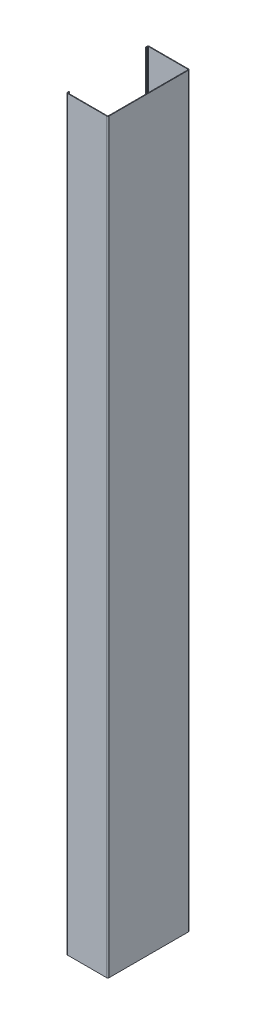
ISO-10303-21;
HEADER;
FILE_DESCRIPTION(('STEP AP214'),'2;1');
FILE_NAME('part.step','',(''),(''),'','','');
FILE_SCHEMA(('AUTOMOTIVE_DESIGN { 1 0 10303 214 1 1 1 1 }'));
ENDSEC;
DATA;
#1=APPLICATION_CONTEXT('core data for automotive mechanical design processes');
#2=APPLICATION_PROTOCOL_DEFINITION('international standard','automotive_design',2000,#1);
#3=PRODUCT_CONTEXT('',#1,'mechanical');
#4=PRODUCT('Part','Part','',(#3));
#5=PRODUCT_RELATED_PRODUCT_CATEGORY('part','',(#4));
#6=PRODUCT_DEFINITION_FORMATION('','',#4);
#7=PRODUCT_DEFINITION_CONTEXT('part definition',#1,'design');
#8=PRODUCT_DEFINITION('design','',#6,#7);
#9=PRODUCT_DEFINITION_SHAPE('','',#8);
#10=(LENGTH_UNIT() NAMED_UNIT(*) SI_UNIT(.MILLI.,.METRE.));
#11=(NAMED_UNIT(*) PLANE_ANGLE_UNIT() SI_UNIT($,.RADIAN.));
#12=(NAMED_UNIT(*) SI_UNIT($,.STERADIAN.) SOLID_ANGLE_UNIT());
#13=UNCERTAINTY_MEASURE_WITH_UNIT(LENGTH_MEASURE(1.E-05),#10,'distance_accuracy_value','');
#14=(GEOMETRIC_REPRESENTATION_CONTEXT(3) GLOBAL_UNCERTAINTY_ASSIGNED_CONTEXT((#13)) GLOBAL_UNIT_ASSIGNED_CONTEXT((#10,
#11,#12)) REPRESENTATION_CONTEXT('',''));
#15=CARTESIAN_POINT('',(0.,0.,0.));
#16=DIRECTION('',(0.,0.,1.));
#17=DIRECTION('',(1.,0.,0.));
#18=AXIS2_PLACEMENT_3D('',#15,#16,#17);
#19=CARTESIAN_POINT('',(-50.,3000.,-49.25));
#20=DIRECTION('',(1.,0.,0.));
#21=DIRECTION('',(0.,0.,-1.));
#22=AXIS2_PLACEMENT_3D('',#19,#20,#21);
#23=PLANE('',#22);
#24=DIRECTION('',(0.,0.,-1.));
#25=VECTOR('',#24,1.);
#26=CARTESIAN_POINT('',(-50.,899.25,49.25));
#27=LINE('',#26,#25);
#28=CARTESIAN_POINT('',(-50.,899.25,-46.25));
#29=VERTEX_POINT('',#28);
#30=CARTESIAN_POINT('',(-50.,899.25,-47.75));
#31=VERTEX_POINT('',#30);
#32=EDGE_CURVE('E184',#29,#31,#27,.T.);
#33=ORIENTED_EDGE('',*,*,#32,.T.);
#34=DIRECTION('',(0.,-1.,0.));
#35=VECTOR('',#34,1.);
#36=CARTESIAN_POINT('',(-50.,3000.,-47.75));
#37=LINE('',#36,#35);
#38=CARTESIAN_POINT('',(-50.,0.,-47.75));
#39=VERTEX_POINT('',#38);
#40=EDGE_CURVE('E59',#31,#39,#37,.T.);
#41=ORIENTED_EDGE('',*,*,#40,.T.);
#42=DIRECTION('',(0.,0.,1.));
#43=VECTOR('',#42,1.);
#44=CARTESIAN_POINT('',(-50.,0.,-49.25));
#45=LINE('',#44,#43);
#46=CARTESIAN_POINT('',(-50.,0.,-46.25));
#47=VERTEX_POINT('',#46);
#48=EDGE_CURVE('E236',#39,#47,#45,.T.);
#49=ORIENTED_EDGE('',*,*,#48,.T.);
#50=DIRECTION('',(0.,-1.,0.));
#51=VECTOR('',#50,1.);
#52=CARTESIAN_POINT('',(-50.,3000.,-46.25));
#53=LINE('',#52,#51);
#54=EDGE_CURVE('E45',#29,#47,#53,.T.);
#55=ORIENTED_EDGE('',*,*,#54,.F.);
#56=EDGE_LOOP('',(#33,#41,#49,#55));
#57=FACE_BOUND('',#56,.T.);
#58=ADVANCED_FACE('F38',(#57),#23,.F.);
#59=CARTESIAN_POINT('',(-49.25,3000.,-46.25));
#60=DIRECTION('',(0.,0.,1.));
#61=DIRECTION('',(1.,0.,0.));
#62=AXIS2_PLACEMENT_3D('',#59,#60,#61);
#63=PLANE('',#62);
#64=DIRECTION('',(0.,-1.,0.));
#65=VECTOR('',#64,1.);
#66=CARTESIAN_POINT('',(-49.25,3000.,-46.25));
#67=LINE('',#66,#65);
#68=CARTESIAN_POINT('',(-49.25,899.25,-46.25));
#69=VERTEX_POINT('',#68);
#70=CARTESIAN_POINT('',(-49.25,0.,-46.25));
#71=VERTEX_POINT('',#70);
#72=EDGE_CURVE('E224',#69,#71,#67,.T.);
#73=ORIENTED_EDGE('',*,*,#72,.F.);
#74=DIRECTION('',(-1.,0.,0.));
#75=VECTOR('',#74,1.);
#76=CARTESIAN_POINT('',(-49.25,899.25,-46.25));
#77=LINE('',#76,#75);
#78=EDGE_CURVE('E234',#69,#29,#77,.T.);
#79=ORIENTED_EDGE('',*,*,#78,.T.);
#80=ORIENTED_EDGE('',*,*,#54,.T.);
#81=DIRECTION('',(-1.,0.,0.));
#82=VECTOR('',#81,1.);
#83=CARTESIAN_POINT('',(-49.25,0.,-46.25));
#84=LINE('',#83,#82);
#85=EDGE_CURVE('E232',#71,#47,#84,.T.);
#86=ORIENTED_EDGE('',*,*,#85,.F.);
#87=EDGE_LOOP('',(#73,#79,#80,#86));
#88=FACE_BOUND('',#87,.T.);
#89=ADVANCED_FACE('F230',(#88),#63,.T.);
#90=CARTESIAN_POINT('',(-49.25,3000.,-49.25));
#91=DIRECTION('',(1.,0.,0.));
#92=DIRECTION('',(0.,0.,-1.));
#93=AXIS2_PLACEMENT_3D('',#90,#91,#92);
#94=PLANE('',#93);
#95=DIRECTION('',(0.,-1.,0.));
#96=VECTOR('',#95,1.);
#97=CARTESIAN_POINT('',(-49.25,3000.,-47.75));
#98=LINE('',#97,#96);
#99=CARTESIAN_POINT('',(-49.25,899.25,-47.75));
#100=VERTEX_POINT('',#99);
#101=CARTESIAN_POINT('',(-49.25,0.,-47.75));
#102=VERTEX_POINT('',#101);
#103=EDGE_CURVE('E222',#100,#102,#98,.T.);
#104=ORIENTED_EDGE('',*,*,#103,.F.);
#105=DIRECTION('',(0.,0.,1.));
#106=VECTOR('',#105,1.);
#107=CARTESIAN_POINT('',(-49.25,899.25,-49.25));
#108=LINE('',#107,#106);
#109=EDGE_CURVE('E352',#100,#69,#108,.T.);
#110=ORIENTED_EDGE('',*,*,#109,.T.);
#111=ORIENTED_EDGE('',*,*,#72,.T.);
#112=DIRECTION('',(0.,0.,-1.));
#113=VECTOR('',#112,1.);
#114=CARTESIAN_POINT('',(-49.25,0.,-49.25));
#115=LINE('',#114,#113);
#116=EDGE_CURVE('E244',#102,#71,#115,.F.);
#117=ORIENTED_EDGE('',*,*,#116,.F.);
#118=EDGE_LOOP('',(#104,#110,#111,#117));
#119=FACE_BOUND('',#118,.T.);
#120=ADVANCED_FACE('F356',(#119),#94,.T.);
#121=CARTESIAN_POINT('',(-48.5,3000.,-47.75));
#122=DIRECTION('',(0.,-1.,0.));
#123=DIRECTION('',(0.,0.,-1.));
#124=AXIS2_PLACEMENT_3D('',#121,#122,#123);
#125=CYLINDRICAL_SURFACE('',#124,0.75);
#126=DIRECTION('',(0.,-1.,0.));
#127=VECTOR('',#126,1.);
#128=CARTESIAN_POINT('',(-48.5,3000.,-48.5));
#129=LINE('',#128,#127);
#130=CARTESIAN_POINT('',(-48.5,899.25,-48.5));
#131=VERTEX_POINT('',#130);
#132=CARTESIAN_POINT('',(-48.5,0.,-48.5));
#133=VERTEX_POINT('',#132);
#134=EDGE_CURVE('E220',#131,#133,#129,.T.);
#135=ORIENTED_EDGE('',*,*,#134,.F.);
#136=CARTESIAN_POINT('',(-48.5,899.25,-47.75));
#137=DIRECTION('',(0.,1.,0.));
#138=DIRECTION('',(0.,0.,1.));
#139=AXIS2_PLACEMENT_3D('',#136,#137,#138);
#140=CIRCLE('',#139,0.75);
#141=EDGE_CURVE('E349',#131,#100,#140,.T.);
#142=ORIENTED_EDGE('',*,*,#141,.T.);
#143=ORIENTED_EDGE('',*,*,#103,.T.);
#144=CARTESIAN_POINT('',(-48.5,0.,-47.75));
#145=DIRECTION('',(0.,1.,0.));
#146=DIRECTION('',(1.,0.,0.));
#147=AXIS2_PLACEMENT_3D('',#144,#145,#146);
#148=CIRCLE('',#147,0.75);
#149=EDGE_CURVE('E246',#133,#102,#148,.T.);
#150=ORIENTED_EDGE('',*,*,#149,.F.);
#151=EDGE_LOOP('',(#135,#142,#143,#150));
#152=FACE_BOUND('',#151,.T.);
#153=ADVANCED_FACE('F359',(#152),#125,.F.);
#154=CARTESIAN_POINT('',(-50.,3000.,-48.5));
#155=DIRECTION('',(0.,0.,1.));
#156=DIRECTION('',(1.,0.,0.));
#157=AXIS2_PLACEMENT_3D('',#154,#155,#156);
#158=PLANE('',#157);
#159=DIRECTION('',(0.,-1.,0.));
#160=VECTOR('',#159,1.);
#161=CARTESIAN_POINT('',(-1.50000000000004,3000.,-48.5));
#162=LINE('',#161,#160);
#163=CARTESIAN_POINT('',(-1.50000000000004,899.25,-48.5));
#164=VERTEX_POINT('',#163);
#165=CARTESIAN_POINT('',(-1.50000000000004,0.,-48.5));
#166=VERTEX_POINT('',#165);
#167=EDGE_CURVE('E218',#164,#166,#162,.T.);
#168=ORIENTED_EDGE('',*,*,#167,.F.);
#169=DIRECTION('',(-1.,0.,0.));
#170=VECTOR('',#169,1.);
#171=CARTESIAN_POINT('',(-50.,899.25,-48.5));
#172=LINE('',#171,#170);
#173=EDGE_CURVE('E346',#164,#131,#172,.T.);
#174=ORIENTED_EDGE('',*,*,#173,.T.);
#175=ORIENTED_EDGE('',*,*,#134,.T.);
#176=DIRECTION('',(1.,0.,0.));
#177=VECTOR('',#176,1.);
#178=CARTESIAN_POINT('',(-50.,0.,-48.5));
#179=LINE('',#178,#177);
#180=EDGE_CURVE('E251',#166,#133,#179,.F.);
#181=ORIENTED_EDGE('',*,*,#180,.F.);
#182=EDGE_LOOP('',(#168,#174,#175,#181));
#183=FACE_BOUND('',#182,.T.);
#184=ADVANCED_FACE('F364',(#183),#158,.T.);
#185=CARTESIAN_POINT('',(-1.50000000000004,3000.,-47.75));
#186=DIRECTION('',(0.,-1.,0.));
#187=DIRECTION('',(0.,0.,-1.));
#188=AXIS2_PLACEMENT_3D('',#185,#186,#187);
#189=CYLINDRICAL_SURFACE('',#188,0.75);
#190=DIRECTION('',(0.,-1.,0.));
#191=VECTOR('',#190,1.);
#192=CARTESIAN_POINT('',(-0.750000000000037,3000.,-47.75));
#193=LINE('',#192,#191);
#194=CARTESIAN_POINT('',(-0.750000000000037,899.25,-47.75));
#195=VERTEX_POINT('',#194);
#196=CARTESIAN_POINT('',(-0.750000000000037,0.,-47.75));
#197=VERTEX_POINT('',#196);
#198=EDGE_CURVE('E216',#195,#197,#193,.T.);
#199=ORIENTED_EDGE('',*,*,#198,.F.);
#200=CARTESIAN_POINT('',(-1.50000000000004,899.25,-47.75));
#201=DIRECTION('',(0.,1.,0.));
#202=DIRECTION('',(0.,0.,1.));
#203=AXIS2_PLACEMENT_3D('',#200,#201,#202);
#204=CIRCLE('',#203,0.75);
#205=EDGE_CURVE('E343',#195,#164,#204,.T.);
#206=ORIENTED_EDGE('',*,*,#205,.T.);
#207=ORIENTED_EDGE('',*,*,#167,.T.);
#208=CARTESIAN_POINT('',(-1.50000000000004,0.,-47.75));
#209=DIRECTION('',(0.,1.,0.));
#210=DIRECTION('',(1.,0.,0.));
#211=AXIS2_PLACEMENT_3D('',#208,#209,#210);
#212=CIRCLE('',#211,0.75);
#213=EDGE_CURVE('E254',#197,#166,#212,.T.);
#214=ORIENTED_EDGE('',*,*,#213,.F.);
#215=EDGE_LOOP('',(#199,#206,#207,#214));
#216=FACE_BOUND('',#215,.T.);
#217=ADVANCED_FACE('F367',(#216),#189,.F.);
#218=CARTESIAN_POINT('',(-0.750000000000038,3000.,-49.25));
#219=DIRECTION('',(-1.,0.,0.));
#220=DIRECTION('',(0.,0.,1.));
#221=AXIS2_PLACEMENT_3D('',#218,#219,#220);
#222=PLANE('',#221);
#223=DIRECTION('',(0.,-1.,0.));
#224=VECTOR('',#223,1.);
#225=CARTESIAN_POINT('',(-0.749999999999984,3000.,47.75));
#226=LINE('',#225,#224);
#227=CARTESIAN_POINT('',(-0.749999999999984,899.25,47.75));
#228=VERTEX_POINT('',#227);
#229=CARTESIAN_POINT('',(-0.749999999999984,0.,47.75));
#230=VERTEX_POINT('',#229);
#231=EDGE_CURVE('E214',#228,#230,#226,.T.);
#232=ORIENTED_EDGE('',*,*,#231,.F.);
#233=DIRECTION('',(0.,0.,-1.));
#234=VECTOR('',#233,1.);
#235=CARTESIAN_POINT('',(-0.750000000000038,899.25,-49.25));
#236=LINE('',#235,#234);
#237=EDGE_CURVE('E340',#228,#195,#236,.T.);
#238=ORIENTED_EDGE('',*,*,#237,.T.);
#239=ORIENTED_EDGE('',*,*,#198,.T.);
#240=DIRECTION('',(0.,0.,-1.));
#241=VECTOR('',#240,1.);
#242=CARTESIAN_POINT('',(-0.750000000000038,0.,-49.25));
#243=LINE('',#242,#241);
#244=EDGE_CURVE('E257',#230,#197,#243,.T.);
#245=ORIENTED_EDGE('',*,*,#244,.F.);
#246=EDGE_LOOP('',(#232,#238,#239,#245));
#247=FACE_BOUND('',#246,.T.);
#248=ADVANCED_FACE('F372',(#247),#222,.T.);
#249=CARTESIAN_POINT('',(-1.49999999999998,3000.,47.75));
#250=DIRECTION('',(0.,-1.,0.));
#251=DIRECTION('',(0.,0.,-1.));
#252=AXIS2_PLACEMENT_3D('',#249,#250,#251);
#253=CYLINDRICAL_SURFACE('',#252,0.75);
#254=DIRECTION('',(0.,-1.,0.));
#255=VECTOR('',#254,1.);
#256=CARTESIAN_POINT('',(-1.49999999999998,3000.,48.5));
#257=LINE('',#256,#255);
#258=CARTESIAN_POINT('',(-1.49999999999998,899.25,48.5));
#259=VERTEX_POINT('',#258);
#260=CARTESIAN_POINT('',(-1.49999999999998,0.,48.5));
#261=VERTEX_POINT('',#260);
#262=EDGE_CURVE('E212',#259,#261,#257,.T.);
#263=ORIENTED_EDGE('',*,*,#262,.F.);
#264=CARTESIAN_POINT('',(-1.49999999999998,899.25,47.75));
#265=DIRECTION('',(0.,1.,0.));
#266=DIRECTION('',(0.,0.,1.));
#267=AXIS2_PLACEMENT_3D('',#264,#265,#266);
#268=CIRCLE('',#267,0.75);
#269=EDGE_CURVE('E337',#259,#228,#268,.T.);
#270=ORIENTED_EDGE('',*,*,#269,.T.);
#271=ORIENTED_EDGE('',*,*,#231,.T.);
#272=CARTESIAN_POINT('',(-1.49999999999998,0.,47.75));
#273=DIRECTION('',(0.,1.,0.));
#274=DIRECTION('',(1.,0.,0.));
#275=AXIS2_PLACEMENT_3D('',#272,#273,#274);
#276=CIRCLE('',#275,0.75);
#277=EDGE_CURVE('E260',#261,#230,#276,.T.);
#278=ORIENTED_EDGE('',*,*,#277,.F.);
#279=EDGE_LOOP('',(#263,#270,#271,#278));
#280=FACE_BOUND('',#279,.T.);
#281=ADVANCED_FACE('F375',(#280),#253,.F.);
#282=CARTESIAN_POINT('',(0.,3000.,48.5));
#283=DIRECTION('',(0.,0.,-1.));
#284=DIRECTION('',(-1.,0.,0.));
#285=AXIS2_PLACEMENT_3D('',#282,#283,#284);
#286=PLANE('',#285);
#287=DIRECTION('',(0.,-1.,0.));
#288=VECTOR('',#287,1.);
#289=CARTESIAN_POINT('',(-48.5,3000.,48.5));
#290=LINE('',#289,#288);
#291=CARTESIAN_POINT('',(-48.5,899.25,48.5));
#292=VERTEX_POINT('',#291);
#293=CARTESIAN_POINT('',(-48.5,0.,48.5));
#294=VERTEX_POINT('',#293);
#295=EDGE_CURVE('E210',#292,#294,#290,.T.);
#296=ORIENTED_EDGE('',*,*,#295,.F.);
#297=DIRECTION('',(1.,0.,0.));
#298=VECTOR('',#297,1.);
#299=CARTESIAN_POINT('',(0.,899.25,48.5));
#300=LINE('',#299,#298);
#301=EDGE_CURVE('E334',#292,#259,#300,.T.);
#302=ORIENTED_EDGE('',*,*,#301,.T.);
#303=ORIENTED_EDGE('',*,*,#262,.T.);
#304=DIRECTION('',(1.,0.,0.));
#305=VECTOR('',#304,1.);
#306=CARTESIAN_POINT('',(0.,0.,48.5));
#307=LINE('',#306,#305);
#308=EDGE_CURVE('E263',#294,#261,#307,.T.);
#309=ORIENTED_EDGE('',*,*,#308,.F.);
#310=EDGE_LOOP('',(#296,#302,#303,#309));
#311=FACE_BOUND('',#310,.T.);
#312=ADVANCED_FACE('F380',(#311),#286,.T.);
#313=CARTESIAN_POINT('',(-48.5,3000.,47.75));
#314=DIRECTION('',(0.,-1.,0.));
#315=DIRECTION('',(0.,0.,-1.));
#316=AXIS2_PLACEMENT_3D('',#313,#314,#315);
#317=CYLINDRICAL_SURFACE('',#316,0.75);
#318=DIRECTION('',(0.,-1.,0.));
#319=VECTOR('',#318,1.);
#320=CARTESIAN_POINT('',(-49.25,3000.,47.75));
#321=LINE('',#320,#319);
#322=CARTESIAN_POINT('',(-49.25,899.25,47.75));
#323=VERTEX_POINT('',#322);
#324=CARTESIAN_POINT('',(-49.25,0.,47.75));
#325=VERTEX_POINT('',#324);
#326=EDGE_CURVE('E208',#323,#325,#321,.T.);
#327=ORIENTED_EDGE('',*,*,#326,.F.);
#328=CARTESIAN_POINT('',(-48.5,899.25,47.75));
#329=DIRECTION('',(0.,1.,0.));
#330=DIRECTION('',(0.,0.,1.));
#331=AXIS2_PLACEMENT_3D('',#328,#329,#330);
#332=CIRCLE('',#331,0.75);
#333=EDGE_CURVE('E331',#323,#292,#332,.T.);
#334=ORIENTED_EDGE('',*,*,#333,.T.);
#335=ORIENTED_EDGE('',*,*,#295,.T.);
#336=CARTESIAN_POINT('',(-48.5,0.,47.75));
#337=DIRECTION('',(0.,1.,0.));
#338=DIRECTION('',(1.,0.,0.));
#339=AXIS2_PLACEMENT_3D('',#336,#337,#338);
#340=CIRCLE('',#339,0.75);
#341=EDGE_CURVE('E266',#325,#294,#340,.T.);
#342=ORIENTED_EDGE('',*,*,#341,.F.);
#343=EDGE_LOOP('',(#327,#334,#335,#342));
#344=FACE_BOUND('',#343,.T.);
#345=ADVANCED_FACE('F383',(#344),#317,.F.);
#346=CARTESIAN_POINT('',(-49.25,3000.,49.25));
#347=DIRECTION('',(1.,0.,0.));
#348=DIRECTION('',(0.,0.,-1.));
#349=AXIS2_PLACEMENT_3D('',#346,#347,#348);
#350=PLANE('',#349);
#351=DIRECTION('',(0.,-1.,0.));
#352=VECTOR('',#351,1.);
#353=CARTESIAN_POINT('',(-49.25,3000.,46.25));
#354=LINE('',#353,#352);
#355=CARTESIAN_POINT('',(-49.25,899.25,46.25));
#356=VERTEX_POINT('',#355);
#357=CARTESIAN_POINT('',(-49.25,0.,46.25));
#358=VERTEX_POINT('',#357);
#359=EDGE_CURVE('E201',#356,#358,#354,.T.);
#360=ORIENTED_EDGE('',*,*,#359,.F.);
#361=DIRECTION('',(0.,0.,1.));
#362=VECTOR('',#361,1.);
#363=CARTESIAN_POINT('',(-49.25,899.25,49.25));
#364=LINE('',#363,#362);
#365=EDGE_CURVE('E328',#356,#323,#364,.T.);
#366=ORIENTED_EDGE('',*,*,#365,.T.);
#367=ORIENTED_EDGE('',*,*,#326,.T.);
#368=DIRECTION('',(0.,0.,-1.));
#369=VECTOR('',#368,1.);
#370=CARTESIAN_POINT('',(-49.25,0.,49.25));
#371=LINE('',#370,#369);
#372=EDGE_CURVE('E269',#358,#325,#371,.F.);
#373=ORIENTED_EDGE('',*,*,#372,.F.);
#374=EDGE_LOOP('',(#360,#366,#367,#373));
#375=FACE_BOUND('',#374,.T.);
#376=ADVANCED_FACE('F388',(#375),#350,.T.);
#377=CARTESIAN_POINT('',(-50.,3000.,46.25));
#378=DIRECTION('',(0.,0.,-1.));
#379=DIRECTION('',(-1.,0.,0.));
#380=AXIS2_PLACEMENT_3D('',#377,#378,#379);
#381=PLANE('',#380);
#382=DIRECTION('',(0.,-1.,0.));
#383=VECTOR('',#382,1.);
#384=CARTESIAN_POINT('',(-50.,3000.,46.25));
#385=LINE('',#384,#383);
#386=CARTESIAN_POINT('',(-50.,899.25,46.25));
#387=VERTEX_POINT('',#386);
#388=CARTESIAN_POINT('',(-50.,0.,46.25));
#389=VERTEX_POINT('',#388);
#390=EDGE_CURVE('E199',#387,#389,#385,.T.);
#391=ORIENTED_EDGE('',*,*,#390,.F.);
#392=DIRECTION('',(1.,0.,0.));
#393=VECTOR('',#392,1.);
#394=CARTESIAN_POINT('',(-50.,899.25,46.25));
#395=LINE('',#394,#393);
#396=EDGE_CURVE('E179',#387,#356,#395,.T.);
#397=ORIENTED_EDGE('',*,*,#396,.T.);
#398=ORIENTED_EDGE('',*,*,#359,.T.);
#399=DIRECTION('',(1.,0.,0.));
#400=VECTOR('',#399,1.);
#401=CARTESIAN_POINT('',(-50.,0.,46.25));
#402=LINE('',#401,#400);
#403=EDGE_CURVE('E271',#389,#358,#402,.T.);
#404=ORIENTED_EDGE('',*,*,#403,.F.);
#405=EDGE_LOOP('',(#391,#397,#398,#404));
#406=FACE_BOUND('',#405,.T.);
#407=ADVANCED_FACE('F390',(#406),#381,.T.);
#408=CARTESIAN_POINT('',(-50.,3000.,49.25));
#409=DIRECTION('',(1.,0.,0.));
#410=DIRECTION('',(0.,0.,-1.));
#411=AXIS2_PLACEMENT_3D('',#408,#409,#410);
#412=PLANE('',#411);
#413=CARTESIAN_POINT('',(-50.,899.25,47.75));
#414=VERTEX_POINT('',#413);
#415=EDGE_CURVE('E173',#414,#387,#27,.T.);
#416=ORIENTED_EDGE('',*,*,#415,.T.);
#417=ORIENTED_EDGE('',*,*,#390,.T.);
#418=DIRECTION('',(0.,0.,1.));
#419=VECTOR('',#418,1.);
#420=CARTESIAN_POINT('',(-50.,0.,49.25));
#421=LINE('',#420,#419);
#422=CARTESIAN_POINT('',(-50.,0.,47.75));
#423=VERTEX_POINT('',#422);
#424=EDGE_CURVE('E197',#389,#423,#421,.T.);
#425=ORIENTED_EDGE('',*,*,#424,.T.);
#426=DIRECTION('',(0.,-1.,0.));
#427=VECTOR('',#426,1.);
#428=CARTESIAN_POINT('',(-50.,3000.,47.75));
#429=LINE('',#428,#427);
#430=EDGE_CURVE('E190',#414,#423,#429,.T.);
#431=ORIENTED_EDGE('',*,*,#430,.F.);
#432=EDGE_LOOP('',(#416,#417,#425,#431));
#433=FACE_BOUND('',#432,.T.);
#434=ADVANCED_FACE('F195',(#433),#412,.F.);
#435=CARTESIAN_POINT('',(-48.5,3000.,47.75));
#436=DIRECTION('',(0.,-1.,0.));
#437=DIRECTION('',(0.,0.,-1.));
#438=AXIS2_PLACEMENT_3D('',#435,#436,#437);
#439=CYLINDRICAL_SURFACE('',#438,1.5);
#440=CARTESIAN_POINT('',(-48.5,899.25,47.75));
#441=DIRECTION('',(0.,1.,0.));
#442=DIRECTION('',(0.,0.,1.));
#443=AXIS2_PLACEMENT_3D('',#440,#441,#442);
#444=CIRCLE('',#443,1.5);
#445=CARTESIAN_POINT('',(-48.5,899.25,49.25));
#446=VERTEX_POINT('',#445);
#447=EDGE_CURVE('E176',#414,#446,#444,.T.);
#448=ORIENTED_EDGE('',*,*,#447,.F.);
#449=ORIENTED_EDGE('',*,*,#430,.T.);
#450=CARTESIAN_POINT('',(-48.5,0.,47.75));
#451=DIRECTION('',(0.,-1.,0.));
#452=DIRECTION('',(0.,0.,-1.));
#453=AXIS2_PLACEMENT_3D('',#450,#451,#452);
#454=CIRCLE('',#453,1.5);
#455=CARTESIAN_POINT('',(-48.5,0.,49.25));
#456=VERTEX_POINT('',#455);
#457=EDGE_CURVE('E275',#423,#456,#454,.F.);
#458=ORIENTED_EDGE('',*,*,#457,.T.);
#459=DIRECTION('',(0.,-1.,0.));
#460=VECTOR('',#459,1.);
#461=CARTESIAN_POINT('',(-48.5,3000.,49.25));
#462=LINE('',#461,#460);
#463=EDGE_CURVE('E192',#446,#456,#462,.T.);
#464=ORIENTED_EDGE('',*,*,#463,.F.);
#465=EDGE_LOOP('',(#448,#449,#458,#464));
#466=FACE_BOUND('',#465,.T.);
#467=ADVANCED_FACE('F188',(#466),#439,.T.);
#468=CARTESIAN_POINT('',(0.,3000.,49.25));
#469=DIRECTION('',(0.,0.,-1.));
#470=DIRECTION('',(-1.,0.,0.));
#471=AXIS2_PLACEMENT_3D('',#468,#469,#470);
#472=PLANE('',#471);
#473=DIRECTION('',(1.,0.,0.));
#474=VECTOR('',#473,1.);
#475=CARTESIAN_POINT('',(1.66408553603503E-13,899.25,49.25));
#476=LINE('',#475,#474);
#477=CARTESIAN_POINT('',(-1.49999999999998,899.25,49.25));
#478=VERTEX_POINT('',#477);
#479=EDGE_CURVE('E324',#446,#478,#476,.T.);
#480=ORIENTED_EDGE('',*,*,#479,.F.);
#481=ORIENTED_EDGE('',*,*,#463,.T.);
#482=DIRECTION('',(1.,0.,0.));
#483=VECTOR('',#482,1.);
#484=CARTESIAN_POINT('',(0.,0.,49.25));
#485=LINE('',#484,#483);
#486=CARTESIAN_POINT('',(-1.49999999999998,0.,49.25));
#487=VERTEX_POINT('',#486);
#488=EDGE_CURVE('E277',#456,#487,#485,.T.);
#489=ORIENTED_EDGE('',*,*,#488,.T.);
#490=DIRECTION('',(0.,-1.,0.));
#491=VECTOR('',#490,1.);
#492=CARTESIAN_POINT('',(-1.49999999999998,3000.,49.25));
#493=LINE('',#492,#491);
#494=EDGE_CURVE('E203',#478,#487,#493,.T.);
#495=ORIENTED_EDGE('',*,*,#494,.F.);
#496=EDGE_LOOP('',(#480,#481,#489,#495));
#497=FACE_BOUND('',#496,.T.);
#498=ADVANCED_FACE('F311',(#497),#472,.F.);
#499=CARTESIAN_POINT('',(-1.49999999999998,3000.,47.75));
#500=DIRECTION('',(0.,-1.,0.));
#501=DIRECTION('',(0.,0.,-1.));
#502=AXIS2_PLACEMENT_3D('',#499,#500,#501);
#503=CYLINDRICAL_SURFACE('',#502,1.5);
#504=CARTESIAN_POINT('',(-1.49999999999998,899.25,47.75));
#505=DIRECTION('',(0.,1.,0.));
#506=DIRECTION('',(0.,0.,1.));
#507=AXIS2_PLACEMENT_3D('',#504,#505,#506);
#508=CIRCLE('',#507,1.5);
#509=CARTESIAN_POINT('',(1.66408553603503E-13,899.25,47.75));
#510=VERTEX_POINT('',#509);
#511=EDGE_CURVE('E193',#478,#510,#508,.T.);
#512=ORIENTED_EDGE('',*,*,#511,.F.);
#513=ORIENTED_EDGE('',*,*,#494,.T.);
#514=CARTESIAN_POINT('',(-1.49999999999998,0.,47.75));
#515=DIRECTION('',(0.,-1.,0.));
#516=DIRECTION('',(0.,0.,-1.));
#517=AXIS2_PLACEMENT_3D('',#514,#515,#516);
#518=CIRCLE('',#517,1.5);
#519=CARTESIAN_POINT('',(0.,0.,47.75));
#520=VERTEX_POINT('',#519);
#521=EDGE_CURVE('E280',#487,#520,#518,.F.);
#522=ORIENTED_EDGE('',*,*,#521,.T.);
#523=DIRECTION('',(0.,-1.,0.));
#524=VECTOR('',#523,1.);
#525=CARTESIAN_POINT('',(0.,3000.,47.75));
#526=LINE('',#525,#524);
#527=EDGE_CURVE('E301',#510,#520,#526,.T.);
#528=ORIENTED_EDGE('',*,*,#527,.F.);
#529=EDGE_LOOP('',(#512,#513,#522,#528));
#530=FACE_BOUND('',#529,.T.);
#531=ADVANCED_FACE('F305',(#530),#503,.T.);
#532=CARTESIAN_POINT('',(0.,3000.,-49.25));
#533=DIRECTION('',(-1.,0.,0.));
#534=DIRECTION('',(0.,0.,1.));
#535=AXIS2_PLACEMENT_3D('',#532,#533,#534);
#536=PLANE('',#535);
#537=DIRECTION('',(0.,0.,-1.));
#538=VECTOR('',#537,1.);
#539=CARTESIAN_POINT('',(1.66408553603503E-13,899.25,49.25));
#540=LINE('',#539,#538);
#541=CARTESIAN_POINT('',(1.66316613259276E-13,899.25,-47.75));
#542=VERTEX_POINT('',#541);
#543=EDGE_CURVE('E183',#510,#542,#540,.T.);
#544=ORIENTED_EDGE('',*,*,#543,.F.);
#545=ORIENTED_EDGE('',*,*,#527,.T.);
#546=DIRECTION('',(0.,0.,-1.));
#547=VECTOR('',#546,1.);
#548=CARTESIAN_POINT('',(0.,0.,-49.25));
#549=LINE('',#548,#547);
#550=CARTESIAN_POINT('',(0.,0.,-47.75));
#551=VERTEX_POINT('',#550);
#552=EDGE_CURVE('E283',#520,#551,#549,.T.);
#553=ORIENTED_EDGE('',*,*,#552,.T.);
#554=DIRECTION('',(0.,-1.,0.));
#555=VECTOR('',#554,1.);
#556=CARTESIAN_POINT('',(0.,3000.,-47.75));
#557=LINE('',#556,#555);
#558=EDGE_CURVE('E299',#542,#551,#557,.T.);
#559=ORIENTED_EDGE('',*,*,#558,.F.);
#560=EDGE_LOOP('',(#544,#545,#553,#559));
#561=FACE_BOUND('',#560,.T.);
#562=ADVANCED_FACE('F317',(#561),#536,.F.);
#563=CARTESIAN_POINT('',(-1.50000000000004,3000.,-47.75));
#564=DIRECTION('',(0.,-1.,0.));
#565=DIRECTION('',(0.,0.,-1.));
#566=AXIS2_PLACEMENT_3D('',#563,#564,#565);
#567=CYLINDRICAL_SURFACE('',#566,1.5);
#568=CARTESIAN_POINT('',(-1.50000000000004,899.25,-47.75));
#569=DIRECTION('',(0.,1.,0.));
#570=DIRECTION('',(0.,0.,1.));
#571=AXIS2_PLACEMENT_3D('',#568,#569,#570);
#572=CIRCLE('',#571,1.5);
#573=CARTESIAN_POINT('',(-1.50000000000004,899.25,-49.25));
#574=VERTEX_POINT('',#573);
#575=EDGE_CURVE('E319',#542,#574,#572,.T.);
#576=ORIENTED_EDGE('',*,*,#575,.F.);
#577=ORIENTED_EDGE('',*,*,#558,.T.);
#578=CARTESIAN_POINT('',(-1.50000000000004,0.,-47.75));
#579=DIRECTION('',(0.,-1.,0.));
#580=DIRECTION('',(0.,0.,-1.));
#581=AXIS2_PLACEMENT_3D('',#578,#579,#580);
#582=CIRCLE('',#581,1.5);
#583=CARTESIAN_POINT('',(-1.50000000000004,0.,-49.25));
#584=VERTEX_POINT('',#583);
#585=EDGE_CURVE('E286',#551,#584,#582,.F.);
#586=ORIENTED_EDGE('',*,*,#585,.T.);
#587=DIRECTION('',(0.,-1.,0.));
#588=VECTOR('',#587,1.);
#589=CARTESIAN_POINT('',(-1.50000000000004,3000.,-49.25));
#590=LINE('',#589,#588);
#591=EDGE_CURVE('E297',#574,#584,#590,.T.);
#592=ORIENTED_EDGE('',*,*,#591,.F.);
#593=EDGE_LOOP('',(#576,#577,#586,#592));
#594=FACE_BOUND('',#593,.T.);
#595=ADVANCED_FACE('F473',(#594),#567,.T.);
#596=CARTESIAN_POINT('',(-50.,3000.,-49.25));
#597=DIRECTION('',(0.,0.,1.));
#598=DIRECTION('',(1.,0.,0.));
#599=AXIS2_PLACEMENT_3D('',#596,#597,#598);
#600=PLANE('',#599);
#601=DIRECTION('',(1.,0.,0.));
#602=VECTOR('',#601,1.);
#603=CARTESIAN_POINT('',(1.66408553603503E-13,899.25,-49.25));
#604=LINE('',#603,#602);
#605=CARTESIAN_POINT('',(-48.5,899.25,-49.25));
#606=VERTEX_POINT('',#605);
#607=EDGE_CURVE('E51',#606,#574,#604,.T.);
#608=ORIENTED_EDGE('',*,*,#607,.T.);
#609=ORIENTED_EDGE('',*,*,#591,.T.);
#610=DIRECTION('',(-1.,0.,0.));
#611=VECTOR('',#610,1.);
#612=CARTESIAN_POINT('',(-50.,0.,-49.25));
#613=LINE('',#612,#611);
#614=CARTESIAN_POINT('',(-48.5,0.,-49.25));
#615=VERTEX_POINT('',#614);
#616=EDGE_CURVE('E289',#584,#615,#613,.T.);
#617=ORIENTED_EDGE('',*,*,#616,.T.);
#618=DIRECTION('',(0.,-1.,0.));
#619=VECTOR('',#618,1.);
#620=CARTESIAN_POINT('',(-48.5,3000.,-49.25));
#621=LINE('',#620,#619);
#622=EDGE_CURVE('E295',#606,#615,#621,.T.);
#623=ORIENTED_EDGE('',*,*,#622,.F.);
#624=EDGE_LOOP('',(#608,#609,#617,#623));
#625=FACE_BOUND('',#624,.T.);
#626=ADVANCED_FACE('F482',(#625),#600,.F.);
#627=CARTESIAN_POINT('',(-48.5,3000.,-47.75));
#628=DIRECTION('',(0.,-1.,0.));
#629=DIRECTION('',(0.,0.,-1.));
#630=AXIS2_PLACEMENT_3D('',#627,#628,#629);
#631=CYLINDRICAL_SURFACE('',#630,1.5);
#632=CARTESIAN_POINT('',(-48.5,899.25,-47.75));
#633=DIRECTION('',(0.,1.,0.));
#634=DIRECTION('',(0.,0.,1.));
#635=AXIS2_PLACEMENT_3D('',#632,#633,#634);
#636=CIRCLE('',#635,1.5);
#637=EDGE_CURVE('E12',#606,#31,#636,.T.);
#638=ORIENTED_EDGE('',*,*,#637,.F.);
#639=ORIENTED_EDGE('',*,*,#622,.T.);
#640=CARTESIAN_POINT('',(-48.5,0.,-47.75));
#641=DIRECTION('',(0.,-1.,0.));
#642=DIRECTION('',(0.,0.,-1.));
#643=AXIS2_PLACEMENT_3D('',#640,#641,#642);
#644=CIRCLE('',#643,1.5);
#645=EDGE_CURVE('E292',#615,#39,#644,.F.);
#646=ORIENTED_EDGE('',*,*,#645,.T.);
#647=ORIENTED_EDGE('',*,*,#40,.F.);
#648=EDGE_LOOP('',(#638,#639,#646,#647));
#649=FACE_BOUND('',#648,.T.);
#650=ADVANCED_FACE('F492',(#649),#631,.T.);
#651=CARTESIAN_POINT('',(-48.5,0.,-47.75));
#652=DIRECTION('',(0.,1.,0.));
#653=DIRECTION('',(1.,0.,0.));
#654=AXIS2_PLACEMENT_3D('',#651,#652,#653);
#655=PLANE('',#654);
#656=ORIENTED_EDGE('',*,*,#372,.T.);
#657=ORIENTED_EDGE('',*,*,#341,.T.);
#658=ORIENTED_EDGE('',*,*,#308,.T.);
#659=ORIENTED_EDGE('',*,*,#277,.T.);
#660=ORIENTED_EDGE('',*,*,#244,.T.);
#661=ORIENTED_EDGE('',*,*,#213,.T.);
#662=ORIENTED_EDGE('',*,*,#180,.T.);
#663=ORIENTED_EDGE('',*,*,#149,.T.);
#664=ORIENTED_EDGE('',*,*,#116,.T.);
#665=ORIENTED_EDGE('',*,*,#85,.T.);
#666=ORIENTED_EDGE('',*,*,#48,.F.);
#667=ORIENTED_EDGE('',*,*,#645,.F.);
#668=ORIENTED_EDGE('',*,*,#616,.F.);
#669=ORIENTED_EDGE('',*,*,#585,.F.);
#670=ORIENTED_EDGE('',*,*,#552,.F.);
#671=ORIENTED_EDGE('',*,*,#521,.F.);
#672=ORIENTED_EDGE('',*,*,#488,.F.);
#673=ORIENTED_EDGE('',*,*,#457,.F.);
#674=ORIENTED_EDGE('',*,*,#424,.F.);
#675=ORIENTED_EDGE('',*,*,#403,.T.);
#676=EDGE_LOOP('',(#656,#657,#658,#659,#660,#661,#662,#663,#664,#665,#666,#667,#668,#669,#670,
#671,#672,#673,#674,#675));
#677=FACE_BOUND('',#676,.T.);
#678=ADVANCED_FACE('F241',(#677),#655,.F.);
#679=CARTESIAN_POINT('',(1.66408553603503E-13,899.25,49.25));
#680=DIRECTION('',(0.,1.,0.));
#681=DIRECTION('',(0.,0.,1.));
#682=AXIS2_PLACEMENT_3D('',#679,#680,#681);
#683=PLANE('',#682);
#684=ORIENTED_EDGE('',*,*,#109,.F.);
#685=ORIENTED_EDGE('',*,*,#141,.F.);
#686=ORIENTED_EDGE('',*,*,#173,.F.);
#687=ORIENTED_EDGE('',*,*,#205,.F.);
#688=ORIENTED_EDGE('',*,*,#237,.F.);
#689=ORIENTED_EDGE('',*,*,#269,.F.);
#690=ORIENTED_EDGE('',*,*,#301,.F.);
#691=ORIENTED_EDGE('',*,*,#333,.F.);
#692=ORIENTED_EDGE('',*,*,#365,.F.);
#693=ORIENTED_EDGE('',*,*,#396,.F.);
#694=ORIENTED_EDGE('',*,*,#415,.F.);
#695=ORIENTED_EDGE('',*,*,#447,.T.);
#696=ORIENTED_EDGE('',*,*,#479,.T.);
#697=ORIENTED_EDGE('',*,*,#511,.T.);
#698=ORIENTED_EDGE('',*,*,#543,.T.);
#699=ORIENTED_EDGE('',*,*,#575,.T.);
#700=ORIENTED_EDGE('',*,*,#607,.F.);
#701=ORIENTED_EDGE('',*,*,#637,.T.);
#702=ORIENTED_EDGE('',*,*,#32,.F.);
#703=ORIENTED_EDGE('',*,*,#78,.F.);
#704=EDGE_LOOP('',(#684,#685,#686,#687,#688,#689,#690,#691,#692,#693,#694,#695,#696,#697,#698,
#699,#700,#701,#702,#703));
#705=FACE_BOUND('',#704,.T.);
#706=ADVANCED_FACE('F175',(#705),#683,.T.);
#707=CLOSED_SHELL('',(#58,#89,#120,#153,#184,#217,#248,#281,#312,#345,#376,#407,#434,#467,#498,
#531,#562,#595,#626,#650,#678,#706));
#708=MANIFOLD_SOLID_BREP('B2',#707);
#709=ADVANCED_BREP_SHAPE_REPRESENTATION('',(#18,#708),#14);
#710=SHAPE_DEFINITION_REPRESENTATION(#9,#709);
ENDSEC;
END-ISO-10303-21;
